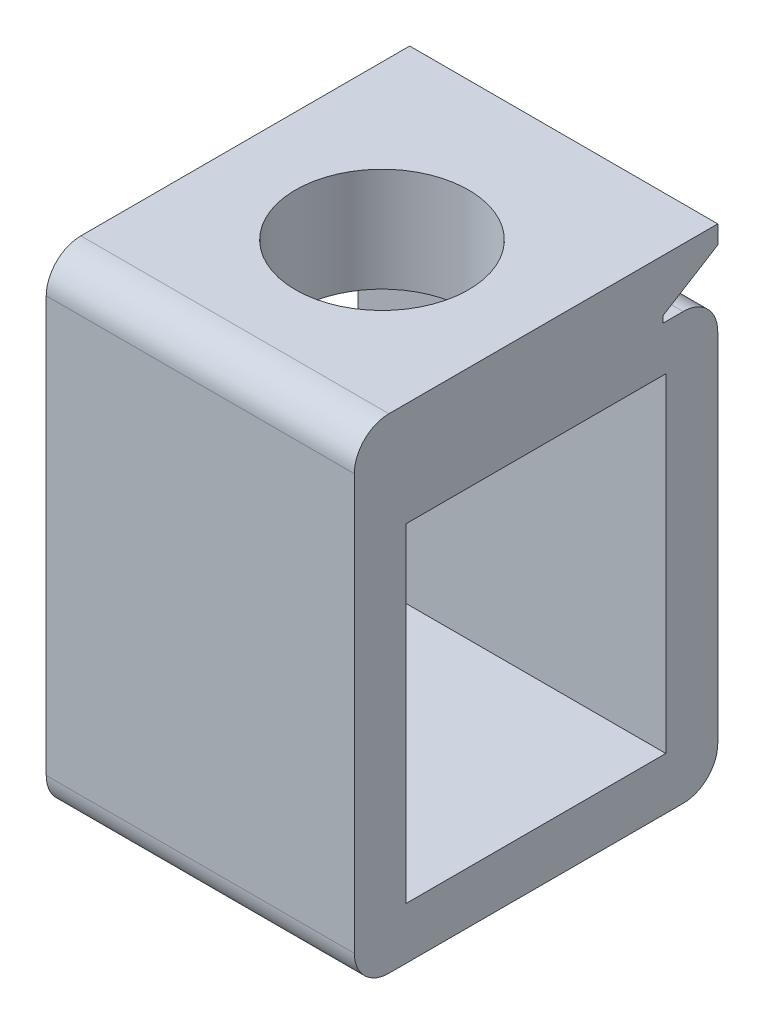
ISO-10303-21;
HEADER;
FILE_DESCRIPTION(('STEP AP214'),'2;1');
FILE_NAME('part.step','',(''),(''),'','','');
FILE_SCHEMA(('AUTOMOTIVE_DESIGN { 1 0 10303 214 1 1 1 1 }'));
ENDSEC;
DATA;
#1=APPLICATION_CONTEXT('core data for automotive mechanical design processes');
#2=APPLICATION_PROTOCOL_DEFINITION('international standard','automotive_design',2000,#1);
#3=PRODUCT_CONTEXT('',#1,'mechanical');
#4=PRODUCT('Part','Part','',(#3));
#5=PRODUCT_RELATED_PRODUCT_CATEGORY('part','',(#4));
#6=PRODUCT_DEFINITION_FORMATION('','',#4);
#7=PRODUCT_DEFINITION_CONTEXT('part definition',#1,'design');
#8=PRODUCT_DEFINITION('design','',#6,#7);
#9=PRODUCT_DEFINITION_SHAPE('','',#8);
#10=(LENGTH_UNIT() NAMED_UNIT(*) SI_UNIT(.MILLI.,.METRE.));
#11=(NAMED_UNIT(*) PLANE_ANGLE_UNIT() SI_UNIT($,.RADIAN.));
#12=(NAMED_UNIT(*) SI_UNIT($,.STERADIAN.) SOLID_ANGLE_UNIT());
#13=UNCERTAINTY_MEASURE_WITH_UNIT(LENGTH_MEASURE(1.E-05),#10,'distance_accuracy_value','');
#14=(GEOMETRIC_REPRESENTATION_CONTEXT(3) GLOBAL_UNCERTAINTY_ASSIGNED_CONTEXT((#13)) GLOBAL_UNIT_ASSIGNED_CONTEXT((#10,
#11,#12)) REPRESENTATION_CONTEXT('',''));
#15=CARTESIAN_POINT('',(0.,0.,0.));
#16=DIRECTION('',(0.,0.,1.));
#17=DIRECTION('',(1.,0.,0.));
#18=AXIS2_PLACEMENT_3D('',#15,#16,#17);
#19=CARTESIAN_POINT('',(-4.45,7.,-5.25));
#20=DIRECTION('',(0.,0.,-1.));
#21=DIRECTION('',(0.,1.,0.));
#22=AXIS2_PLACEMENT_3D('',#19,#20,#21);
#23=PLANE('',#22);
#24=DIRECTION('',(0.,1.,0.));
#25=VECTOR('',#24,1.);
#26=CARTESIAN_POINT('',(4.45,7.,-5.25));
#27=LINE('',#26,#25);
#28=CARTESIAN_POINT('',(4.45000000000001,6.47098586947559,-5.25));
#29=VERTEX_POINT('',#28);
#30=CARTESIAN_POINT('',(4.45,7.,-5.25));
#31=VERTEX_POINT('',#30);
#32=EDGE_CURVE('E200',#29,#31,#27,.T.);
#33=ORIENTED_EDGE('',*,*,#32,.F.);
#34=DIRECTION('',(-1.,0.,0.));
#35=VECTOR('',#34,1.);
#36=CARTESIAN_POINT('',(28.9914190706243,6.47098586947559,-5.25));
#37=LINE('',#36,#35);
#38=CARTESIAN_POINT('',(-4.44999999999999,6.47098586947559,-5.25));
#39=VERTEX_POINT('',#38);
#40=EDGE_CURVE('E162',#29,#39,#37,.T.);
#41=ORIENTED_EDGE('',*,*,#40,.T.);
#42=DIRECTION('',(0.,1.,0.));
#43=VECTOR('',#42,1.);
#44=CARTESIAN_POINT('',(-4.45,7.,-5.25));
#45=LINE('',#44,#43);
#46=CARTESIAN_POINT('',(-4.45,7.,-5.25));
#47=VERTEX_POINT('',#46);
#48=EDGE_CURVE('E233',#39,#47,#45,.T.);
#49=ORIENTED_EDGE('',*,*,#48,.T.);
#50=DIRECTION('',(1.,0.,0.));
#51=VECTOR('',#50,1.);
#52=CARTESIAN_POINT('',(-4.45,7.,-5.25));
#53=LINE('',#52,#51);
#54=EDGE_CURVE('E240',#47,#31,#53,.T.);
#55=ORIENTED_EDGE('',*,*,#54,.T.);
#56=EDGE_LOOP('',(#33,#41,#49,#55));
#57=FACE_BOUND('',#56,.T.);
#58=ADVANCED_FACE('F35',(#57),#23,.T.);
#59=CARTESIAN_POINT('',(-4.45,-5.99999999999999,-5.25000000000001));
#60=VERTEX_POINT('',#59);
#61=CARTESIAN_POINT('',(-4.45,4.30653431528374,-5.25));
#62=VERTEX_POINT('',#61);
#63=EDGE_CURVE('E234',#60,#62,#45,.T.);
#64=ORIENTED_EDGE('',*,*,#63,.T.);
#65=DIRECTION('',(-1.,0.,0.));
#66=VECTOR('',#65,1.);
#67=CARTESIAN_POINT('',(-4.45,4.30653431528374,-5.25));
#68=LINE('',#67,#66);
#69=CARTESIAN_POINT('',(4.45,4.30653431528374,-5.25));
#70=VERTEX_POINT('',#69);
#71=EDGE_CURVE('E262',#62,#70,#68,.F.);
#72=ORIENTED_EDGE('',*,*,#71,.T.);
#73=CARTESIAN_POINT('',(4.45,-5.99999999999999,-5.25000000000001));
#74=VERTEX_POINT('',#73);
#75=EDGE_CURVE('E201',#74,#70,#27,.T.);
#76=ORIENTED_EDGE('',*,*,#75,.F.);
#77=DIRECTION('',(1.,0.,0.));
#78=VECTOR('',#77,1.);
#79=CARTESIAN_POINT('',(-4.45,-6.,-5.25000000000001));
#80=LINE('',#79,#78);
#81=EDGE_CURVE('E260',#74,#60,#80,.F.);
#82=ORIENTED_EDGE('',*,*,#81,.T.);
#83=EDGE_LOOP('',(#64,#72,#76,#82));
#84=FACE_BOUND('',#83,.T.);
#85=ADVANCED_FACE('F301',(#84),#23,.T.);
#86=CARTESIAN_POINT('',(-4.45,0.,0.));
#87=DIRECTION('',(1.,0.,0.));
#88=DIRECTION('',(0.,0.,-1.));
#89=AXIS2_PLACEMENT_3D('',#86,#87,#88);
#90=PLANE('',#89);
#91=DIRECTION('',(0.,0.,-1.));
#92=VECTOR('',#91,1.);
#93=CARTESIAN_POINT('',(-4.45,-5.5,-3.75000000000001));
#94=LINE('',#93,#92);
#95=CARTESIAN_POINT('',(-4.45,-5.5,3.75));
#96=VERTEX_POINT('',#95);
#97=CARTESIAN_POINT('',(-4.45,-5.5,-3.75000000000001));
#98=VERTEX_POINT('',#97);
#99=EDGE_CURVE('E216',#96,#98,#94,.T.);
#100=ORIENTED_EDGE('',*,*,#99,.T.);
#101=DIRECTION('',(0.,1.,0.));
#102=VECTOR('',#101,1.);
#103=CARTESIAN_POINT('',(-4.45,-5.5,-3.75000000000001));
#104=LINE('',#103,#102);
#105=CARTESIAN_POINT('',(-4.45,4.,-3.75000000000001));
#106=VERTEX_POINT('',#105);
#107=EDGE_CURVE('E207',#98,#106,#104,.T.);
#108=ORIENTED_EDGE('',*,*,#107,.T.);
#109=DIRECTION('',(0.,0.,1.));
#110=VECTOR('',#109,1.);
#111=CARTESIAN_POINT('',(-4.45,4.,-3.75000000000001));
#112=LINE('',#111,#110);
#113=CARTESIAN_POINT('',(-4.45,4.,3.75));
#114=VERTEX_POINT('',#113);
#115=EDGE_CURVE('E210',#106,#114,#112,.T.);
#116=ORIENTED_EDGE('',*,*,#115,.T.);
#117=DIRECTION('',(0.,-1.,0.));
#118=VECTOR('',#117,1.);
#119=CARTESIAN_POINT('',(-4.45,-5.5,3.75));
#120=LINE('',#119,#118);
#121=EDGE_CURVE('E213',#114,#96,#120,.T.);
#122=ORIENTED_EDGE('',*,*,#121,.T.);
#123=EDGE_LOOP('',(#100,#108,#116,#122));
#124=FACE_BOUND('',#123,.T.);
#125=DIRECTION('',(0.,0.,1.));
#126=VECTOR('',#125,1.);
#127=CARTESIAN_POINT('',(-4.45,5.30653431528374,0.));
#128=LINE('',#127,#126);
#129=CARTESIAN_POINT('',(-4.45,5.30653431528374,-4.25));
#130=VERTEX_POINT('',#129);
#131=CARTESIAN_POINT('',(-4.44999999999999,5.30653431528374,-3.66105649789782));
#132=VERTEX_POINT('',#131);
#133=EDGE_CURVE('E151',#130,#132,#128,.T.);
#134=ORIENTED_EDGE('',*,*,#133,.F.);
#135=CARTESIAN_POINT('',(-4.45,4.30653431528374,-4.25));
#136=DIRECTION('',(1.,0.,0.));
#137=DIRECTION('',(0.,0.,-1.));
#138=AXIS2_PLACEMENT_3D('',#135,#136,#137);
#139=CIRCLE('',#138,1.);
#140=EDGE_CURVE('E258',#130,#62,#139,.F.);
#141=ORIENTED_EDGE('',*,*,#140,.T.);
#142=ORIENTED_EDGE('',*,*,#63,.F.);
#143=CARTESIAN_POINT('',(-4.45,-6.,-4.25000000000001));
#144=DIRECTION('',(1.,0.,0.));
#145=DIRECTION('',(0.,0.,-1.));
#146=AXIS2_PLACEMENT_3D('',#143,#144,#145);
#147=CIRCLE('',#146,1.);
#148=CARTESIAN_POINT('',(-4.45,-7.,-4.25000000000001));
#149=VERTEX_POINT('',#148);
#150=EDGE_CURVE('E256',#60,#149,#147,.F.);
#151=ORIENTED_EDGE('',*,*,#150,.T.);
#152=DIRECTION('',(0.,0.,-1.));
#153=VECTOR('',#152,1.);
#154=CARTESIAN_POINT('',(-4.45,-7.,5.25));
#155=LINE('',#154,#153);
#156=CARTESIAN_POINT('',(-4.45,-7.,4.25));
#157=VERTEX_POINT('',#156);
#158=EDGE_CURVE('E230',#157,#149,#155,.T.);
#159=ORIENTED_EDGE('',*,*,#158,.F.);
#160=CARTESIAN_POINT('',(-4.45,-6.,4.25));
#161=DIRECTION('',(1.,0.,0.));
#162=DIRECTION('',(0.,0.,-1.));
#163=AXIS2_PLACEMENT_3D('',#160,#161,#162);
#164=CIRCLE('',#163,1.);
#165=CARTESIAN_POINT('',(-4.45,-6.,5.25));
#166=VERTEX_POINT('',#165);
#167=EDGE_CURVE('E254',#157,#166,#164,.F.);
#168=ORIENTED_EDGE('',*,*,#167,.T.);
#169=DIRECTION('',(0.,-1.,0.));
#170=VECTOR('',#169,1.);
#171=CARTESIAN_POINT('',(-4.45,7.,5.25));
#172=LINE('',#171,#170);
#173=CARTESIAN_POINT('',(-4.45,6.,5.25));
#174=VERTEX_POINT('',#173);
#175=EDGE_CURVE('E222',#174,#166,#172,.T.);
#176=ORIENTED_EDGE('',*,*,#175,.F.);
#177=CARTESIAN_POINT('',(-4.45,6.,4.25));
#178=DIRECTION('',(1.,0.,0.));
#179=DIRECTION('',(0.,0.,-1.));
#180=AXIS2_PLACEMENT_3D('',#177,#178,#179);
#181=CIRCLE('',#180,1.);
#182=CARTESIAN_POINT('',(-4.45,7.,4.25));
#183=VERTEX_POINT('',#182);
#184=EDGE_CURVE('E252',#174,#183,#181,.F.);
#185=ORIENTED_EDGE('',*,*,#184,.T.);
#186=DIRECTION('',(0.,0.,1.));
#187=VECTOR('',#186,1.);
#188=CARTESIAN_POINT('',(-4.45,7.,5.25));
#189=LINE('',#188,#187);
#190=EDGE_CURVE('E237',#47,#183,#189,.T.);
#191=ORIENTED_EDGE('',*,*,#190,.F.);
#192=ORIENTED_EDGE('',*,*,#48,.F.);
#193=DIRECTION('',(0.,0.525176694154358,-0.850993207914787));
#194=VECTOR('',#193,1.);
#195=CARTESIAN_POINT('',(-4.45,2.33988018420438,1.44401921005789));
#196=LINE('',#195,#194);
#197=CARTESIAN_POINT('',(-4.44999999999999,5.49039508699825,-3.66105649789782));
#198=VERTEX_POINT('',#197);
#199=EDGE_CURVE('E175',#198,#39,#196,.T.);
#200=ORIENTED_EDGE('',*,*,#199,.F.);
#201=DIRECTION('',(0.,1.,0.));
#202=VECTOR('',#201,1.);
#203=CARTESIAN_POINT('',(-4.45,0.,-3.66105649789782));
#204=LINE('',#203,#202);
#205=EDGE_CURVE('E161',#132,#198,#204,.T.);
#206=ORIENTED_EDGE('',*,*,#205,.F.);
#207=EDGE_LOOP('',(#134,#141,#142,#151,#159,#168,#176,#185,#191,#192,#200,#206));
#208=FACE_BOUND('',#207,.T.);
#209=ADVANCED_FACE('F173',(#124,#208),#90,.F.);
#210=CARTESIAN_POINT('',(4.45,0.,0.));
#211=DIRECTION('',(1.,0.,0.));
#212=DIRECTION('',(0.,0.,-1.));
#213=AXIS2_PLACEMENT_3D('',#210,#211,#212);
#214=PLANE('',#213);
#215=DIRECTION('',(0.,0.,1.));
#216=VECTOR('',#215,1.);
#217=CARTESIAN_POINT('',(4.45,4.,-3.75000000000001));
#218=LINE('',#217,#216);
#219=CARTESIAN_POINT('',(4.45,4.,-3.75000000000001));
#220=VERTEX_POINT('',#219);
#221=CARTESIAN_POINT('',(4.45,4.,3.75));
#222=VERTEX_POINT('',#221);
#223=EDGE_CURVE('E187',#220,#222,#218,.T.);
#224=ORIENTED_EDGE('',*,*,#223,.F.);
#225=DIRECTION('',(0.,1.,0.));
#226=VECTOR('',#225,1.);
#227=CARTESIAN_POINT('',(4.45,-5.5,-3.75000000000001));
#228=LINE('',#227,#226);
#229=CARTESIAN_POINT('',(4.45,-5.5,-3.75000000000001));
#230=VERTEX_POINT('',#229);
#231=EDGE_CURVE('E184',#230,#220,#228,.T.);
#232=ORIENTED_EDGE('',*,*,#231,.F.);
#233=DIRECTION('',(0.,0.,-1.));
#234=VECTOR('',#233,1.);
#235=CARTESIAN_POINT('',(4.45,-5.5,-3.75000000000001));
#236=LINE('',#235,#234);
#237=CARTESIAN_POINT('',(4.45,-5.5,3.75));
#238=VERTEX_POINT('',#237);
#239=EDGE_CURVE('E193',#238,#230,#236,.T.);
#240=ORIENTED_EDGE('',*,*,#239,.F.);
#241=DIRECTION('',(0.,-1.,0.));
#242=VECTOR('',#241,1.);
#243=CARTESIAN_POINT('',(4.45,-5.5,3.75));
#244=LINE('',#243,#242);
#245=EDGE_CURVE('E190',#222,#238,#244,.T.);
#246=ORIENTED_EDGE('',*,*,#245,.F.);
#247=EDGE_LOOP('',(#224,#232,#240,#246));
#248=FACE_BOUND('',#247,.T.);
#249=ORIENTED_EDGE('',*,*,#75,.T.);
#250=CARTESIAN_POINT('',(4.45,4.30653431528374,-4.25));
#251=DIRECTION('',(1.,0.,0.));
#252=DIRECTION('',(0.,0.,-1.));
#253=AXIS2_PLACEMENT_3D('',#250,#251,#252);
#254=CIRCLE('',#253,1.);
#255=CARTESIAN_POINT('',(4.45,5.30653431528374,-4.25));
#256=VERTEX_POINT('',#255);
#257=EDGE_CURVE('E268',#70,#256,#254,.T.);
#258=ORIENTED_EDGE('',*,*,#257,.T.);
#259=DIRECTION('',(0.,0.,1.));
#260=VECTOR('',#259,1.);
#261=CARTESIAN_POINT('',(4.45,5.30653431528374,0.));
#262=LINE('',#261,#260);
#263=CARTESIAN_POINT('',(4.45,5.30653431528374,-3.66105649789782));
#264=VERTEX_POINT('',#263);
#265=EDGE_CURVE('E243',#256,#264,#262,.T.);
#266=ORIENTED_EDGE('',*,*,#265,.T.);
#267=DIRECTION('',(0.,1.,0.));
#268=VECTOR('',#267,1.);
#269=CARTESIAN_POINT('',(4.45,0.,-3.66105649789782));
#270=LINE('',#269,#268);
#271=CARTESIAN_POINT('',(4.45000000000001,5.49039508699825,-3.66105649789782));
#272=VERTEX_POINT('',#271);
#273=EDGE_CURVE('E169',#264,#272,#270,.T.);
#274=ORIENTED_EDGE('',*,*,#273,.T.);
#275=DIRECTION('',(0.,0.525176694154358,-0.850993207914787));
#276=VECTOR('',#275,1.);
#277=CARTESIAN_POINT('',(4.45,2.33988018420438,1.44401921005789));
#278=LINE('',#277,#276);
#279=EDGE_CURVE('E248',#272,#29,#278,.T.);
#280=ORIENTED_EDGE('',*,*,#279,.T.);
#281=ORIENTED_EDGE('',*,*,#32,.T.);
#282=DIRECTION('',(0.,0.,1.));
#283=VECTOR('',#282,1.);
#284=CARTESIAN_POINT('',(4.45,7.,5.25));
#285=LINE('',#284,#283);
#286=CARTESIAN_POINT('',(4.45,7.,4.25));
#287=VERTEX_POINT('',#286);
#288=EDGE_CURVE('E204',#31,#287,#285,.T.);
#289=ORIENTED_EDGE('',*,*,#288,.T.);
#290=CARTESIAN_POINT('',(4.45,6.,4.25));
#291=DIRECTION('',(1.,0.,0.));
#292=DIRECTION('',(0.,0.,-1.));
#293=AXIS2_PLACEMENT_3D('',#290,#291,#292);
#294=CIRCLE('',#293,1.);
#295=CARTESIAN_POINT('',(4.45,6.,5.25));
#296=VERTEX_POINT('',#295);
#297=EDGE_CURVE('E264',#287,#296,#294,.T.);
#298=ORIENTED_EDGE('',*,*,#297,.T.);
#299=DIRECTION('',(0.,-1.,0.));
#300=VECTOR('',#299,1.);
#301=CARTESIAN_POINT('',(4.45,7.,5.25));
#302=LINE('',#301,#300);
#303=CARTESIAN_POINT('',(4.45,-6.,5.25));
#304=VERTEX_POINT('',#303);
#305=EDGE_CURVE('E196',#296,#304,#302,.T.);
#306=ORIENTED_EDGE('',*,*,#305,.T.);
#307=CARTESIAN_POINT('',(4.45,-6.,4.25));
#308=DIRECTION('',(1.,0.,0.));
#309=DIRECTION('',(0.,0.,-1.));
#310=AXIS2_PLACEMENT_3D('',#307,#308,#309);
#311=CIRCLE('',#310,1.);
#312=CARTESIAN_POINT('',(4.45,-7.,4.25));
#313=VERTEX_POINT('',#312);
#314=EDGE_CURVE('E58',#304,#313,#311,.T.);
#315=ORIENTED_EDGE('',*,*,#314,.T.);
#316=DIRECTION('',(0.,0.,-1.));
#317=VECTOR('',#316,1.);
#318=CARTESIAN_POINT('',(4.45,-7.,5.25));
#319=LINE('',#318,#317);
#320=CARTESIAN_POINT('',(4.45,-7.,-4.25000000000001));
#321=VERTEX_POINT('',#320);
#322=EDGE_CURVE('E198',#313,#321,#319,.T.);
#323=ORIENTED_EDGE('',*,*,#322,.T.);
#324=CARTESIAN_POINT('',(4.45,-6.,-4.25000000000001));
#325=DIRECTION('',(1.,0.,0.));
#326=DIRECTION('',(0.,0.,-1.));
#327=AXIS2_PLACEMENT_3D('',#324,#325,#326);
#328=CIRCLE('',#327,1.);
#329=EDGE_CURVE('E50',#321,#74,#328,.T.);
#330=ORIENTED_EDGE('',*,*,#329,.T.);
#331=EDGE_LOOP('',(#249,#258,#266,#274,#280,#281,#289,#298,#306,#315,#323,#330));
#332=FACE_BOUND('',#331,.T.);
#333=ADVANCED_FACE('F284',(#248,#332),#214,.T.);
#334=CARTESIAN_POINT('',(-4.45,7.,5.25));
#335=DIRECTION('',(0.,0.,1.));
#336=DIRECTION('',(1.,0.,0.));
#337=AXIS2_PLACEMENT_3D('',#334,#335,#336);
#338=PLANE('',#337);
#339=ORIENTED_EDGE('',*,*,#175,.T.);
#340=DIRECTION('',(1.,0.,0.));
#341=VECTOR('',#340,1.);
#342=CARTESIAN_POINT('',(-4.45,-6.,5.25));
#343=LINE('',#342,#341);
#344=EDGE_CURVE('E43',#166,#304,#343,.T.);
#345=ORIENTED_EDGE('',*,*,#344,.T.);
#346=ORIENTED_EDGE('',*,*,#305,.F.);
#347=DIRECTION('',(1.,0.,0.));
#348=VECTOR('',#347,1.);
#349=CARTESIAN_POINT('',(-4.45,6.,5.25));
#350=LINE('',#349,#348);
#351=EDGE_CURVE('E274',#296,#174,#350,.F.);
#352=ORIENTED_EDGE('',*,*,#351,.T.);
#353=EDGE_LOOP('',(#339,#345,#346,#352));
#354=FACE_BOUND('',#353,.T.);
#355=ADVANCED_FACE('F279',(#354),#338,.T.);
#356=CARTESIAN_POINT('',(-4.45,7.,5.25));
#357=DIRECTION('',(0.,1.,0.));
#358=DIRECTION('',(0.,0.,1.));
#359=AXIS2_PLACEMENT_3D('',#356,#357,#358);
#360=PLANE('',#359);
#361=CARTESIAN_POINT('',(0.,7.,0.));
#362=DIRECTION('',(0.,1.,0.));
#363=DIRECTION('',(0.,0.,1.));
#364=AXIS2_PLACEMENT_3D('',#361,#362,#363);
#365=CIRCLE('',#364,2.5);
#366=CARTESIAN_POINT('',(0.,7.,2.5));
#367=VERTEX_POINT('',#366);
#368=EDGE_CURVE('E177',#367,#367,#365,.T.);
#369=ORIENTED_EDGE('',*,*,#368,.F.);
#370=EDGE_LOOP('',(#369));
#371=FACE_BOUND('',#370,.T.);
#372=ORIENTED_EDGE('',*,*,#190,.T.);
#373=DIRECTION('',(1.,0.,0.));
#374=VECTOR('',#373,1.);
#375=CARTESIAN_POINT('',(-4.45,7.,4.25));
#376=LINE('',#375,#374);
#377=EDGE_CURVE('E11',#183,#287,#376,.T.);
#378=ORIENTED_EDGE('',*,*,#377,.T.);
#379=ORIENTED_EDGE('',*,*,#288,.F.);
#380=ORIENTED_EDGE('',*,*,#54,.F.);
#381=EDGE_LOOP('',(#372,#378,#379,#380));
#382=FACE_BOUND('',#381,.T.);
#383=ADVANCED_FACE('F290',(#371,#382),#360,.T.);
#384=CARTESIAN_POINT('',(-4.45,-7.,5.25));
#385=DIRECTION('',(0.,-1.,0.));
#386=DIRECTION('',(0.,0.,-1.));
#387=AXIS2_PLACEMENT_3D('',#384,#385,#386);
#388=PLANE('',#387);
#389=ORIENTED_EDGE('',*,*,#158,.T.);
#390=DIRECTION('',(1.,0.,0.));
#391=VECTOR('',#390,1.);
#392=CARTESIAN_POINT('',(-4.45,-7.,-4.25000000000001));
#393=LINE('',#392,#391);
#394=EDGE_CURVE('E272',#149,#321,#393,.T.);
#395=ORIENTED_EDGE('',*,*,#394,.T.);
#396=ORIENTED_EDGE('',*,*,#322,.F.);
#397=DIRECTION('',(1.,0.,0.));
#398=VECTOR('',#397,1.);
#399=CARTESIAN_POINT('',(-4.45,-7.,4.25));
#400=LINE('',#399,#398);
#401=EDGE_CURVE('E270',#313,#157,#400,.F.);
#402=ORIENTED_EDGE('',*,*,#401,.T.);
#403=EDGE_LOOP('',(#389,#395,#396,#402));
#404=FACE_BOUND('',#403,.T.);
#405=ADVANCED_FACE('F297',(#404),#388,.T.);
#406=CARTESIAN_POINT('',(-4.45,-5.5,-3.75000000000001));
#407=DIRECTION('',(0.,0.,-1.));
#408=DIRECTION('',(-1.,0.,0.));
#409=AXIS2_PLACEMENT_3D('',#406,#407,#408);
#410=PLANE('',#409);
#411=DIRECTION('',(1.,0.,0.));
#412=VECTOR('',#411,1.);
#413=CARTESIAN_POINT('',(-4.45,-5.5,-3.75000000000001));
#414=LINE('',#413,#412);
#415=EDGE_CURVE('E220',#98,#230,#414,.T.);
#416=ORIENTED_EDGE('',*,*,#415,.T.);
#417=ORIENTED_EDGE('',*,*,#231,.T.);
#418=DIRECTION('',(1.,0.,0.));
#419=VECTOR('',#418,1.);
#420=CARTESIAN_POINT('',(-4.45,4.,-3.75000000000001));
#421=LINE('',#420,#419);
#422=EDGE_CURVE('E219',#106,#220,#421,.T.);
#423=ORIENTED_EDGE('',*,*,#422,.F.);
#424=ORIENTED_EDGE('',*,*,#107,.F.);
#425=EDGE_LOOP('',(#416,#417,#423,#424));
#426=FACE_BOUND('',#425,.T.);
#427=ADVANCED_FACE('F335',(#426),#410,.F.);
#428=CARTESIAN_POINT('',(-4.45,-5.5,-3.75000000000001));
#429=DIRECTION('',(0.,-1.,0.));
#430=DIRECTION('',(0.,0.,-1.));
#431=AXIS2_PLACEMENT_3D('',#428,#429,#430);
#432=PLANE('',#431);
#433=DIRECTION('',(1.,0.,0.));
#434=VECTOR('',#433,1.);
#435=CARTESIAN_POINT('',(-4.45,-5.5,3.75));
#436=LINE('',#435,#434);
#437=EDGE_CURVE('E223',#96,#238,#436,.T.);
#438=ORIENTED_EDGE('',*,*,#437,.T.);
#439=ORIENTED_EDGE('',*,*,#239,.T.);
#440=ORIENTED_EDGE('',*,*,#415,.F.);
#441=ORIENTED_EDGE('',*,*,#99,.F.);
#442=EDGE_LOOP('',(#438,#439,#440,#441));
#443=FACE_BOUND('',#442,.T.);
#444=ADVANCED_FACE('F455',(#443),#432,.F.);
#445=CARTESIAN_POINT('',(-4.45,-5.5,3.75));
#446=DIRECTION('',(0.,0.,1.));
#447=DIRECTION('',(1.,0.,0.));
#448=AXIS2_PLACEMENT_3D('',#445,#446,#447);
#449=PLANE('',#448);
#450=DIRECTION('',(1.,0.,0.));
#451=VECTOR('',#450,1.);
#452=CARTESIAN_POINT('',(-4.45,4.,3.75));
#453=LINE('',#452,#451);
#454=EDGE_CURVE('E225',#114,#222,#453,.T.);
#455=ORIENTED_EDGE('',*,*,#454,.T.);
#456=ORIENTED_EDGE('',*,*,#245,.T.);
#457=ORIENTED_EDGE('',*,*,#437,.F.);
#458=ORIENTED_EDGE('',*,*,#121,.F.);
#459=EDGE_LOOP('',(#455,#456,#457,#458));
#460=FACE_BOUND('',#459,.T.);
#461=ADVANCED_FACE('F445',(#460),#449,.F.);
#462=CARTESIAN_POINT('',(-4.45,4.,-3.75000000000001));
#463=DIRECTION('',(0.,1.,0.));
#464=DIRECTION('',(0.,0.,1.));
#465=AXIS2_PLACEMENT_3D('',#462,#463,#464);
#466=PLANE('',#465);
#467=CARTESIAN_POINT('',(0.,4.,0.));
#468=DIRECTION('',(0.,1.,0.));
#469=DIRECTION('',(0.,0.,1.));
#470=AXIS2_PLACEMENT_3D('',#467,#468,#469);
#471=CIRCLE('',#470,2.5);
#472=CARTESIAN_POINT('',(0.,4.,2.5));
#473=VERTEX_POINT('',#472);
#474=EDGE_CURVE('E183',#473,#473,#471,.T.);
#475=ORIENTED_EDGE('',*,*,#474,.T.);
#476=EDGE_LOOP('',(#475));
#477=FACE_BOUND('',#476,.T.);
#478=ORIENTED_EDGE('',*,*,#422,.T.);
#479=ORIENTED_EDGE('',*,*,#223,.T.);
#480=ORIENTED_EDGE('',*,*,#454,.F.);
#481=ORIENTED_EDGE('',*,*,#115,.F.);
#482=EDGE_LOOP('',(#478,#479,#480,#481));
#483=FACE_BOUND('',#482,.T.);
#484=ADVANCED_FACE('F322',(#477,#483),#466,.F.);
#485=CARTESIAN_POINT('',(0.,2.,0.));
#486=DIRECTION('',(0.,1.,0.));
#487=DIRECTION('',(0.,0.,1.));
#488=AXIS2_PLACEMENT_3D('',#485,#486,#487);
#489=CYLINDRICAL_SURFACE('',#488,2.5);
#490=ORIENTED_EDGE('',*,*,#368,.T.);
#491=EDGE_LOOP('',(#490));
#492=FACE_BOUND('',#491,.T.);
#493=ORIENTED_EDGE('',*,*,#474,.F.);
#494=EDGE_LOOP('',(#493));
#495=FACE_BOUND('',#494,.T.);
#496=ADVANCED_FACE('F315',(#492,#495),#489,.F.);
#497=CARTESIAN_POINT('',(28.9914190706243,6.47098586947559,-5.25));
#498=DIRECTION('',(0.,-0.850993207914787,-0.525176694154357));
#499=DIRECTION('',(0.,0.525176694154358,-0.850993207914787));
#500=AXIS2_PLACEMENT_3D('',#497,#498,#499);
#501=PLANE('',#500);
#502=DIRECTION('',(-1.,0.,0.));
#503=VECTOR('',#502,1.);
#504=CARTESIAN_POINT('',(28.9914190706243,5.49039508699825,-3.66105649789782));
#505=LINE('',#504,#503);
#506=EDGE_CURVE('E170',#272,#198,#505,.T.);
#507=ORIENTED_EDGE('',*,*,#506,.T.);
#508=ORIENTED_EDGE('',*,*,#199,.T.);
#509=ORIENTED_EDGE('',*,*,#40,.F.);
#510=ORIENTED_EDGE('',*,*,#279,.F.);
#511=EDGE_LOOP('',(#507,#508,#509,#510));
#512=FACE_BOUND('',#511,.T.);
#513=ADVANCED_FACE('F313',(#512),#501,.T.);
#514=CARTESIAN_POINT('',(28.9914190706243,5.49039508699825,-3.66105649789782));
#515=DIRECTION('',(0.,0.,-1.));
#516=DIRECTION('',(-1.,0.,0.));
#517=AXIS2_PLACEMENT_3D('',#514,#515,#516);
#518=PLANE('',#517);
#519=DIRECTION('',(-1.,0.,0.));
#520=VECTOR('',#519,1.);
#521=CARTESIAN_POINT('',(28.9914190706243,5.30653431528374,-3.66105649789782));
#522=LINE('',#521,#520);
#523=EDGE_CURVE('E155',#264,#132,#522,.T.);
#524=ORIENTED_EDGE('',*,*,#523,.T.);
#525=ORIENTED_EDGE('',*,*,#205,.T.);
#526=ORIENTED_EDGE('',*,*,#506,.F.);
#527=ORIENTED_EDGE('',*,*,#273,.F.);
#528=EDGE_LOOP('',(#524,#525,#526,#527));
#529=FACE_BOUND('',#528,.T.);
#530=ADVANCED_FACE('F165',(#529),#518,.T.);
#531=CARTESIAN_POINT('',(28.9914190706243,5.30653431528374,-3.66105649789782));
#532=DIRECTION('',(0.,1.,0.));
#533=DIRECTION('',(0.,0.,1.));
#534=AXIS2_PLACEMENT_3D('',#531,#532,#533);
#535=PLANE('',#534);
#536=ORIENTED_EDGE('',*,*,#265,.F.);
#537=DIRECTION('',(-1.,0.,0.));
#538=VECTOR('',#537,1.);
#539=CARTESIAN_POINT('',(28.9914190706243,5.30653431528374,-4.25));
#540=LINE('',#539,#538);
#541=EDGE_CURVE('E158',#256,#130,#540,.T.);
#542=ORIENTED_EDGE('',*,*,#541,.T.);
#543=ORIENTED_EDGE('',*,*,#133,.T.);
#544=ORIENTED_EDGE('',*,*,#523,.F.);
#545=EDGE_LOOP('',(#536,#542,#543,#544));
#546=FACE_BOUND('',#545,.T.);
#547=ADVANCED_FACE('F154',(#546),#535,.T.);
#548=CARTESIAN_POINT('',(28.9914190706243,4.30653431528374,-4.25));
#549=DIRECTION('',(-1.,0.,0.));
#550=DIRECTION('',(0.,0.,1.));
#551=AXIS2_PLACEMENT_3D('',#548,#549,#550);
#552=CYLINDRICAL_SURFACE('',#551,1.);
#553=ORIENTED_EDGE('',*,*,#257,.F.);
#554=ORIENTED_EDGE('',*,*,#71,.F.);
#555=ORIENTED_EDGE('',*,*,#140,.F.);
#556=ORIENTED_EDGE('',*,*,#541,.F.);
#557=EDGE_LOOP('',(#553,#554,#555,#556));
#558=FACE_BOUND('',#557,.T.);
#559=ADVANCED_FACE('F307',(#558),#552,.T.);
#560=CARTESIAN_POINT('',(-4.45,-6.,-4.25000000000001));
#561=DIRECTION('',(1.,0.,0.));
#562=DIRECTION('',(0.,0.,-1.));
#563=AXIS2_PLACEMENT_3D('',#560,#561,#562);
#564=CYLINDRICAL_SURFACE('',#563,1.);
#565=ORIENTED_EDGE('',*,*,#150,.F.);
#566=ORIENTED_EDGE('',*,*,#81,.F.);
#567=ORIENTED_EDGE('',*,*,#329,.F.);
#568=ORIENTED_EDGE('',*,*,#394,.F.);
#569=EDGE_LOOP('',(#565,#566,#567,#568));
#570=FACE_BOUND('',#569,.T.);
#571=ADVANCED_FACE('F305',(#570),#564,.T.);
#572=CARTESIAN_POINT('',(-4.45,-6.,4.25));
#573=DIRECTION('',(1.,0.,0.));
#574=DIRECTION('',(0.,0.,-1.));
#575=AXIS2_PLACEMENT_3D('',#572,#573,#574);
#576=CYLINDRICAL_SURFACE('',#575,1.);
#577=ORIENTED_EDGE('',*,*,#167,.F.);
#578=ORIENTED_EDGE('',*,*,#401,.F.);
#579=ORIENTED_EDGE('',*,*,#314,.F.);
#580=ORIENTED_EDGE('',*,*,#344,.F.);
#581=EDGE_LOOP('',(#577,#578,#579,#580));
#582=FACE_BOUND('',#581,.T.);
#583=ADVANCED_FACE('F295',(#582),#576,.T.);
#584=CARTESIAN_POINT('',(-4.45,6.,4.25));
#585=DIRECTION('',(1.,0.,0.));
#586=DIRECTION('',(0.,0.,-1.));
#587=AXIS2_PLACEMENT_3D('',#584,#585,#586);
#588=CYLINDRICAL_SURFACE('',#587,1.);
#589=ORIENTED_EDGE('',*,*,#184,.F.);
#590=ORIENTED_EDGE('',*,*,#351,.F.);
#591=ORIENTED_EDGE('',*,*,#297,.F.);
#592=ORIENTED_EDGE('',*,*,#377,.F.);
#593=EDGE_LOOP('',(#589,#590,#591,#592));
#594=FACE_BOUND('',#593,.T.);
#595=ADVANCED_FACE('F37',(#594),#588,.T.);
#596=CLOSED_SHELL('',(#58,#85,#209,#333,#355,#383,#405,#427,#444,#461,#484,#496,#513,#530,#547,
#559,#571,#583,#595));
#597=MANIFOLD_SOLID_BREP('B2',#596);
#598=ADVANCED_BREP_SHAPE_REPRESENTATION('',(#18,#597),#14);
#599=SHAPE_DEFINITION_REPRESENTATION(#9,#598);
ENDSEC;
END-ISO-10303-21;
